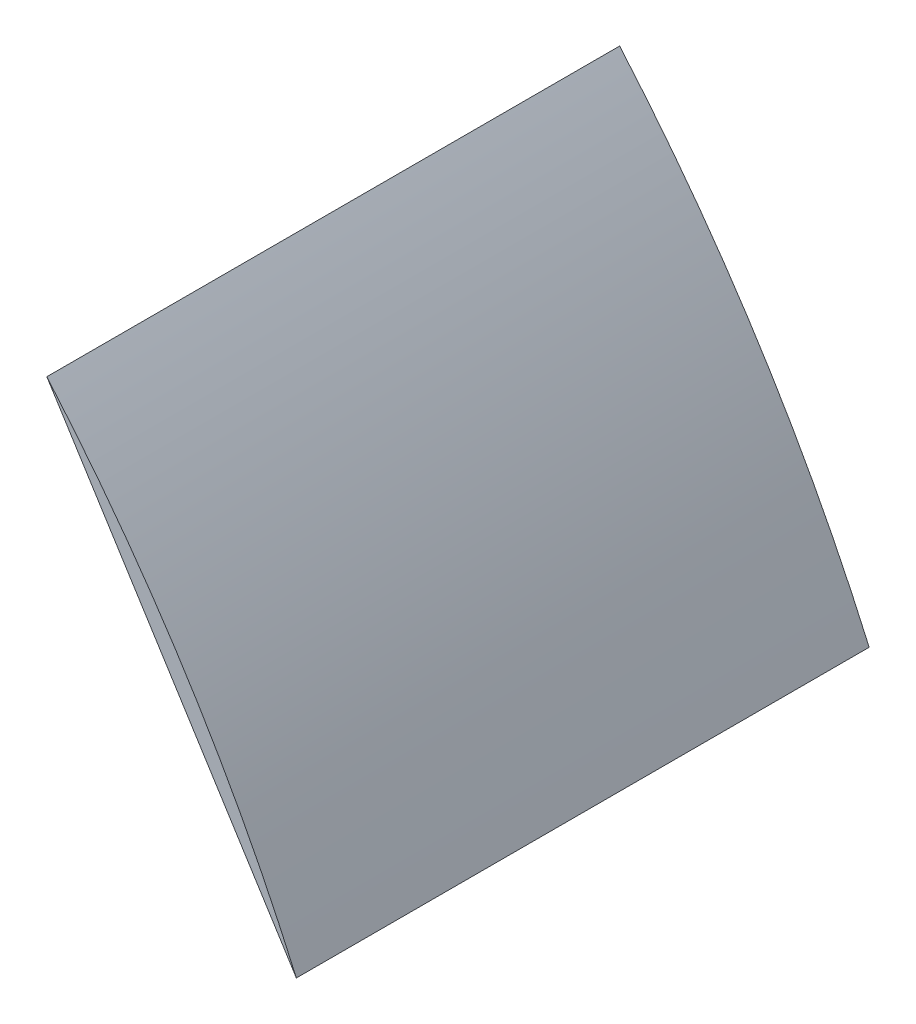
ISO-10303-21;
HEADER;
FILE_DESCRIPTION(('STEP AP214'),'2;1');
FILE_NAME('part.step','',(''),(''),'','','');
FILE_SCHEMA(('AUTOMOTIVE_DESIGN { 1 0 10303 214 1 1 1 1 }'));
ENDSEC;
DATA;
#1=APPLICATION_CONTEXT('core data for automotive mechanical design processes');
#2=APPLICATION_PROTOCOL_DEFINITION('international standard','automotive_design',2000,#1);
#3=PRODUCT_CONTEXT('',#1,'mechanical');
#4=PRODUCT('Part','Part','',(#3));
#5=PRODUCT_RELATED_PRODUCT_CATEGORY('part','',(#4));
#6=PRODUCT_DEFINITION_FORMATION('','',#4);
#7=PRODUCT_DEFINITION_CONTEXT('part definition',#1,'design');
#8=PRODUCT_DEFINITION('design','',#6,#7);
#9=PRODUCT_DEFINITION_SHAPE('','',#8);
#10=(LENGTH_UNIT() NAMED_UNIT(*) SI_UNIT(.MILLI.,.METRE.));
#11=(NAMED_UNIT(*) PLANE_ANGLE_UNIT() SI_UNIT($,.RADIAN.));
#12=(NAMED_UNIT(*) SI_UNIT($,.STERADIAN.) SOLID_ANGLE_UNIT());
#13=UNCERTAINTY_MEASURE_WITH_UNIT(LENGTH_MEASURE(1.E-05),#10,'distance_accuracy_value','');
#14=(GEOMETRIC_REPRESENTATION_CONTEXT(3) GLOBAL_UNCERTAINTY_ASSIGNED_CONTEXT((#13)) GLOBAL_UNIT_ASSIGNED_CONTEXT((#10,
#11,#12)) REPRESENTATION_CONTEXT('',''));
#15=CARTESIAN_POINT('',(0.,0.,0.));
#16=DIRECTION('',(0.,0.,1.));
#17=DIRECTION('',(1.,0.,0.));
#18=AXIS2_PLACEMENT_3D('',#15,#16,#17);
#19=CARTESIAN_POINT('',(-5.137,13.719,7.139));
#20=DIRECTION('',(0.,0.,-1.));
#21=DIRECTION('',(-1.,0.,0.));
#22=AXIS2_PLACEMENT_3D('',#19,#20,#21);
#23=CYLINDRICAL_SURFACE('',#22,19.731);
#24=CARTESIAN_POINT('',(-5.137,13.719,0.));
#25=DIRECTION('',(0.,0.,1.));
#26=DIRECTION('',(1.,0.,0.));
#27=AXIS2_PLACEMENT_3D('',#24,#25,#26);
#28=CIRCLE('',#27,19.731);
#29=CARTESIAN_POINT('',(12.9273076725018,21.6558223687564,0.));
#30=VERTEX_POINT('',#29);
#31=CARTESIAN_POINT('',(9.8174810543582,26.5905134073209,0.));
#32=VERTEX_POINT('',#31);
#33=EDGE_CURVE('E74',#30,#32,#28,.T.);
#34=ORIENTED_EDGE('',*,*,#33,.T.);
#35=DIRECTION('',(0.,0.,-1.));
#36=VECTOR('',#35,1.);
#37=CARTESIAN_POINT('',(9.8174810543582,26.5905134073209,7.139));
#38=LINE('',#37,#36);
#39=CARTESIAN_POINT('',(9.8174810543582,26.5905134073209,7.139));
#40=VERTEX_POINT('',#39);
#41=EDGE_CURVE('E11',#40,#32,#38,.T.);
#42=ORIENTED_EDGE('',*,*,#41,.F.);
#43=CARTESIAN_POINT('',(-5.137,13.719,7.139));
#44=DIRECTION('',(0.,0.,1.));
#45=DIRECTION('',(1.,0.,0.));
#46=AXIS2_PLACEMENT_3D('',#43,#44,#45);
#47=CIRCLE('',#46,19.731);
#48=CARTESIAN_POINT('',(12.9273076725018,21.6558223687564,7.139));
#49=VERTEX_POINT('',#48);
#50=EDGE_CURVE('E72',#49,#40,#47,.T.);
#51=ORIENTED_EDGE('',*,*,#50,.F.);
#52=DIRECTION('',(0.,0.,-1.));
#53=VECTOR('',#52,1.);
#54=CARTESIAN_POINT('',(12.9273076725018,21.6558223687564,7.139));
#55=LINE('',#54,#53);
#56=EDGE_CURVE('E47',#49,#30,#55,.T.);
#57=ORIENTED_EDGE('',*,*,#56,.T.);
#58=EDGE_LOOP('',(#34,#42,#51,#57));
#59=FACE_BOUND('',#58,.T.);
#60=ADVANCED_FACE('F41',(#59),#23,.T.);
#61=CARTESIAN_POINT('',(9.8174810543582,26.5905134073209,7.139));
#62=DIRECTION('',(0.846016411139247,0.533156855046494,0.));
#63=DIRECTION('',(-0.533156855046494,0.846016411139248,0.));
#64=AXIS2_PLACEMENT_3D('',#61,#62,#63);
#65=PLANE('',#64);
#66=DIRECTION('',(0.533156855046494,-0.846016411139247,0.));
#67=VECTOR('',#66,1.);
#68=CARTESIAN_POINT('',(9.8174810543582,26.5905134073209,0.));
#69=LINE('',#68,#67);
#70=EDGE_CURVE('E61',#32,#30,#69,.T.);
#71=ORIENTED_EDGE('',*,*,#70,.T.);
#72=ORIENTED_EDGE('',*,*,#56,.F.);
#73=DIRECTION('',(0.533156855046494,-0.846016411139247,0.));
#74=VECTOR('',#73,1.);
#75=CARTESIAN_POINT('',(9.8174810543582,26.5905134073209,7.139));
#76=LINE('',#75,#74);
#77=EDGE_CURVE('E57',#40,#49,#76,.T.);
#78=ORIENTED_EDGE('',*,*,#77,.F.);
#79=ORIENTED_EDGE('',*,*,#41,.T.);
#80=EDGE_LOOP('',(#71,#72,#78,#79));
#81=FACE_BOUND('',#80,.T.);
#82=ADVANCED_FACE('F70',(#81),#65,.F.);
#83=CARTESIAN_POINT('',(-5.137,13.719,7.139));
#84=DIRECTION('',(0.,0.,1.));
#85=DIRECTION('',(1.,0.,0.));
#86=AXIS2_PLACEMENT_3D('',#83,#84,#85);
#87=PLANE('',#86);
#88=ORIENTED_EDGE('',*,*,#50,.T.);
#89=ORIENTED_EDGE('',*,*,#77,.T.);
#90=EDGE_LOOP('',(#88,#89));
#91=FACE_BOUND('',#90,.T.);
#92=ADVANCED_FACE('F80',(#91),#87,.T.);
#93=CARTESIAN_POINT('',(-5.137,13.719,0.));
#94=DIRECTION('',(0.,0.,1.));
#95=DIRECTION('',(1.,0.,0.));
#96=AXIS2_PLACEMENT_3D('',#93,#94,#95);
#97=PLANE('',#96);
#98=ORIENTED_EDGE('',*,*,#33,.F.);
#99=ORIENTED_EDGE('',*,*,#70,.F.);
#100=EDGE_LOOP('',(#98,#99));
#101=FACE_BOUND('',#100,.T.);
#102=ADVANCED_FACE('F73',(#101),#97,.F.);
#103=CLOSED_SHELL('',(#60,#82,#92,#102));
#104=MANIFOLD_SOLID_BREP('B2',#103);
#105=ADVANCED_BREP_SHAPE_REPRESENTATION('',(#18,#104),#14);
#106=SHAPE_DEFINITION_REPRESENTATION(#9,#105);
ENDSEC;
END-ISO-10303-21;
